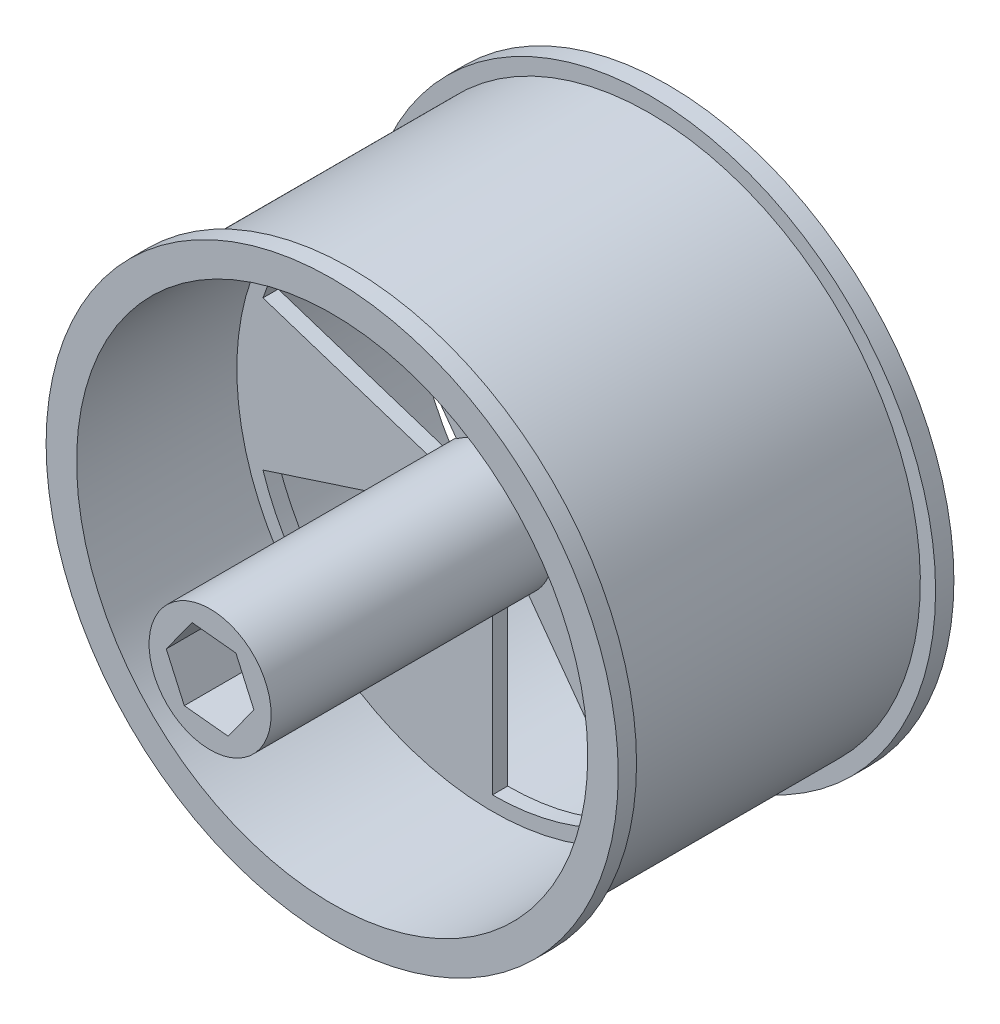
ISO-10303-21;
HEADER;
FILE_DESCRIPTION(('STEP AP214'),'2;1');
FILE_NAME('part.step','',(''),(''),'','','');
FILE_SCHEMA(('AUTOMOTIVE_DESIGN { 1 0 10303 214 1 1 1 1 }'));
ENDSEC;
DATA;
#1=APPLICATION_CONTEXT('core data for automotive mechanical design processes');
#2=APPLICATION_PROTOCOL_DEFINITION('international standard','automotive_design',2000,#1);
#3=PRODUCT_CONTEXT('',#1,'mechanical');
#4=PRODUCT('Part','Part','',(#3));
#5=PRODUCT_RELATED_PRODUCT_CATEGORY('part','',(#4));
#6=PRODUCT_DEFINITION_FORMATION('','',#4);
#7=PRODUCT_DEFINITION_CONTEXT('part definition',#1,'design');
#8=PRODUCT_DEFINITION('design','',#6,#7);
#9=PRODUCT_DEFINITION_SHAPE('','',#8);
#10=(LENGTH_UNIT() NAMED_UNIT(*) SI_UNIT(.MILLI.,.METRE.));
#11=(NAMED_UNIT(*) PLANE_ANGLE_UNIT() SI_UNIT($,.RADIAN.));
#12=(NAMED_UNIT(*) SI_UNIT($,.STERADIAN.) SOLID_ANGLE_UNIT());
#13=UNCERTAINTY_MEASURE_WITH_UNIT(LENGTH_MEASURE(1.E-05),#10,'distance_accuracy_value','');
#14=(GEOMETRIC_REPRESENTATION_CONTEXT(3) GLOBAL_UNCERTAINTY_ASSIGNED_CONTEXT((#13)) GLOBAL_UNIT_ASSIGNED_CONTEXT((#10,
#11,#12)) REPRESENTATION_CONTEXT('',''));
#15=CARTESIAN_POINT('',(0.,0.,0.));
#16=DIRECTION('',(0.,0.,1.));
#17=DIRECTION('',(1.,0.,0.));
#18=AXIS2_PLACEMENT_3D('',#15,#16,#17);
#19=CARTESIAN_POINT('',(0.,0.,14.605));
#20=DIRECTION('',(0.,0.,1.));
#21=DIRECTION('',(1.,0.,0.));
#22=AXIS2_PLACEMENT_3D('',#19,#20,#21);
#23=PLANE('',#22);
#24=CARTESIAN_POINT('',(0.,0.,14.605));
#25=DIRECTION('',(0.,0.,1.));
#26=DIRECTION('',(1.,0.,0.));
#27=AXIS2_PLACEMENT_3D('',#24,#25,#26);
#28=CIRCLE('',#27,21.2725);
#29=CARTESIAN_POINT('',(21.2725,0.,14.605));
#30=VERTEX_POINT('',#29);
#31=EDGE_CURVE('E483',#30,#30,#28,.T.);
#32=ORIENTED_EDGE('',*,*,#31,.T.);
#33=EDGE_LOOP('',(#32));
#34=FACE_BOUND('',#33,.T.);
#35=DIRECTION('',(0.951056516295152,-0.309016994374953,0.));
#36=VECTOR('',#35,1.);
#37=CARTESIAN_POINT('',(0.,0.,14.605));
#38=LINE('',#37,#36);
#39=CARTESIAN_POINT('',(4.83136710277938,-1.56980633142474,14.605));
#40=VERTEX_POINT('',#39);
#41=CARTESIAN_POINT('',(19.0936857187198,-6.20391456369309,14.605));
#42=VERTEX_POINT('',#41);
#43=EDGE_CURVE('E516',#40,#42,#38,.T.);
#44=ORIENTED_EDGE('',*,*,#43,.F.);
#45=CARTESIAN_POINT('',(0.,0.,14.605));
#46=DIRECTION('',(0.,0.,1.));
#47=DIRECTION('',(1.,0.,0.));
#48=AXIS2_PLACEMENT_3D('',#45,#46,#47);
#49=CIRCLE('',#48,5.08);
#50=CARTESIAN_POINT('',(2.98594908164576,-4.10980633142473,14.605));
#51=VERTEX_POINT('',#50);
#52=EDGE_CURVE('E277',#51,#40,#49,.T.);
#53=ORIENTED_EDGE('',*,*,#52,.F.);
#54=DIRECTION('',(-0.587785252292467,0.809016994374952,0.));
#55=VECTOR('',#54,1.);
#56=CARTESIAN_POINT('',(0.,0.,14.605));
#57=LINE('',#56,#55);
#58=CARTESIAN_POINT('',(11.8005467446771,-16.2420591910488,14.605));
#59=VERTEX_POINT('',#58);
#60=EDGE_CURVE('E501',#59,#51,#57,.T.);
#61=ORIENTED_EDGE('',*,*,#60,.F.);
#62=CARTESIAN_POINT('',(0.,0.,14.605));
#63=DIRECTION('',(0.,0.,1.));
#64=DIRECTION('',(1.,0.,0.));
#65=AXIS2_PLACEMENT_3D('',#62,#63,#64);
#66=CIRCLE('',#65,20.0762892547115);
#67=CARTESIAN_POINT('',(-1.42681005899092E-13,-20.0762892547115,14.605));
#68=VERTEX_POINT('',#67);
#69=EDGE_CURVE('E508',#68,#59,#66,.T.);
#70=ORIENTED_EDGE('',*,*,#69,.F.);
#71=DIRECTION('',(0.,-1.,0.));
#72=VECTOR('',#71,1.);
#73=CARTESIAN_POINT('',(0.,0.,14.605));
#74=LINE('',#73,#72);
#75=CARTESIAN_POINT('',(0.,-5.08,14.605));
#76=VERTEX_POINT('',#75);
#77=EDGE_CURVE('E505',#76,#68,#74,.T.);
#78=ORIENTED_EDGE('',*,*,#77,.F.);
#79=CARTESIAN_POINT('',(-2.98594908164576,-4.10980633142473,14.605));
#80=VERTEX_POINT('',#79);
#81=EDGE_CURVE('E922',#80,#76,#49,.T.);
#82=ORIENTED_EDGE('',*,*,#81,.F.);
#83=DIRECTION('',(0.587785252292483,0.80901699437494,0.));
#84=VECTOR('',#83,1.);
#85=CARTESIAN_POINT('',(0.,0.,14.605));
#86=LINE('',#85,#84);
#87=CARTESIAN_POINT('',(-11.8005467446775,-16.2420591910487,14.605));
#88=VERTEX_POINT('',#87);
#89=EDGE_CURVE('E523',#88,#80,#86,.T.);
#90=ORIENTED_EDGE('',*,*,#89,.F.);
#91=CARTESIAN_POINT('',(0.,0.,14.605));
#92=DIRECTION('',(0.,0.,1.));
#93=DIRECTION('',(1.,0.,0.));
#94=AXIS2_PLACEMENT_3D('',#91,#92,#93);
#95=CIRCLE('',#94,20.0762892547115);
#96=CARTESIAN_POINT('',(-19.0936857187198,-6.20391456369282,14.605));
#97=VERTEX_POINT('',#96);
#98=EDGE_CURVE('E530',#97,#88,#95,.T.);
#99=ORIENTED_EDGE('',*,*,#98,.F.);
#100=DIRECTION('',(-0.951056516295158,-0.309016994374935,0.));
#101=VECTOR('',#100,1.);
#102=CARTESIAN_POINT('',(0.,0.,14.605));
#103=LINE('',#102,#101);
#104=CARTESIAN_POINT('',(-4.83136710277938,-1.56980633142473,14.605));
#105=VERTEX_POINT('',#104);
#106=EDGE_CURVE('E527',#105,#97,#103,.T.);
#107=ORIENTED_EDGE('',*,*,#106,.F.);
#108=CARTESIAN_POINT('',(-4.83136710277938,1.56980633142473,14.605));
#109=VERTEX_POINT('',#108);
#110=EDGE_CURVE('E550',#109,#105,#49,.T.);
#111=ORIENTED_EDGE('',*,*,#110,.F.);
#112=DIRECTION('',(0.951056516295149,-0.309016994374962,0.));
#113=VECTOR('',#112,1.);
#114=CARTESIAN_POINT('',(0.,0.,14.605));
#115=LINE('',#114,#113);
#116=CARTESIAN_POINT('',(-19.0936857187197,6.20391456369331,14.605));
#117=VERTEX_POINT('',#116);
#118=EDGE_CURVE('E534',#117,#109,#115,.T.);
#119=ORIENTED_EDGE('',*,*,#118,.F.);
#120=CARTESIAN_POINT('',(0.,0.,14.605));
#121=DIRECTION('',(0.,0.,1.));
#122=DIRECTION('',(1.,0.,0.));
#123=AXIS2_PLACEMENT_3D('',#120,#121,#122);
#124=CIRCLE('',#123,20.0762892547115);
#125=CARTESIAN_POINT('',(-11.8005467446771,16.2420591910489,14.605));
#126=VERTEX_POINT('',#125);
#127=EDGE_CURVE('E12',#126,#117,#124,.T.);
#128=ORIENTED_EDGE('',*,*,#127,.F.);
#129=DIRECTION('',(-0.58778525229246,0.809016994374957,0.));
#130=VECTOR('',#129,1.);
#131=CARTESIAN_POINT('',(0.,0.,14.605));
#132=LINE('',#131,#130);
#133=CARTESIAN_POINT('',(-2.98594908164576,4.10980633142474,14.605));
#134=VERTEX_POINT('',#133);
#135=EDGE_CURVE('E50',#134,#126,#132,.T.);
#136=ORIENTED_EDGE('',*,*,#135,.F.);
#137=CARTESIAN_POINT('',(0.,5.08,14.605));
#138=VERTEX_POINT('',#137);
#139=EDGE_CURVE('E293',#138,#134,#49,.T.);
#140=ORIENTED_EDGE('',*,*,#139,.F.);
#141=DIRECTION('',(0.,-1.,0.));
#142=VECTOR('',#141,1.);
#143=CARTESIAN_POINT('',(0.,0.,14.605));
#144=LINE('',#143,#142);
#145=CARTESIAN_POINT('',(0.,20.0762892547115,14.605));
#146=VERTEX_POINT('',#145);
#147=EDGE_CURVE('E490',#146,#138,#144,.T.);
#148=ORIENTED_EDGE('',*,*,#147,.F.);
#149=CARTESIAN_POINT('',(0.,0.,14.605));
#150=DIRECTION('',(0.,0.,1.));
#151=DIRECTION('',(1.,0.,0.));
#152=AXIS2_PLACEMENT_3D('',#149,#150,#151);
#153=CIRCLE('',#152,20.0762892547115);
#154=CARTESIAN_POINT('',(11.8005467446773,16.2420591910488,14.605));
#155=VERTEX_POINT('',#154);
#156=EDGE_CURVE('E497',#155,#146,#153,.T.);
#157=ORIENTED_EDGE('',*,*,#156,.F.);
#158=DIRECTION('',(0.587785252292474,0.809016994374947,0.));
#159=VECTOR('',#158,1.);
#160=CARTESIAN_POINT('',(0.,0.,14.605));
#161=LINE('',#160,#159);
#162=CARTESIAN_POINT('',(2.98594908164577,4.10980633142473,14.605));
#163=VERTEX_POINT('',#162);
#164=EDGE_CURVE('E494',#163,#155,#161,.T.);
#165=ORIENTED_EDGE('',*,*,#164,.F.);
#166=CARTESIAN_POINT('',(4.83136710277938,1.56980633142473,14.605));
#167=VERTEX_POINT('',#166);
#168=EDGE_CURVE('E289',#167,#163,#49,.T.);
#169=ORIENTED_EDGE('',*,*,#168,.F.);
#170=DIRECTION('',(-0.951056516295155,-0.309016994374944,0.));
#171=VECTOR('',#170,1.);
#172=CARTESIAN_POINT('',(0.,0.,14.605));
#173=LINE('',#172,#171);
#174=CARTESIAN_POINT('',(19.0936857187198,6.20391456369294,14.605));
#175=VERTEX_POINT('',#174);
#176=EDGE_CURVE('E512',#175,#167,#173,.T.);
#177=ORIENTED_EDGE('',*,*,#176,.F.);
#178=CARTESIAN_POINT('',(0.,0.,14.605));
#179=DIRECTION('',(0.,0.,1.));
#180=DIRECTION('',(1.,0.,0.));
#181=AXIS2_PLACEMENT_3D('',#178,#179,#180);
#182=CIRCLE('',#181,20.0762892547115);
#183=EDGE_CURVE('E519',#42,#175,#182,.T.);
#184=ORIENTED_EDGE('',*,*,#183,.F.);
#185=EDGE_LOOP('',(#44,#53,#61,#70,#78,#82,#90,#99,#107,#111,#119,#128,#136,#140,#148,#157,#165,
#169,#177,#184));
#186=FACE_BOUND('',#185,.T.);
#187=ADVANCED_FACE('F41',(#34,#186),#23,.T.);
#188=CARTESIAN_POINT('',(0.,0.,27.94));
#189=DIRECTION('',(0.,0.,-1.));
#190=DIRECTION('',(-1.,0.,0.));
#191=AXIS2_PLACEMENT_3D('',#188,#189,#190);
#192=CYLINDRICAL_SURFACE('',#191,21.2725);
#193=CARTESIAN_POINT('',(0.,0.,0.));
#194=DIRECTION('',(0.,0.,1.));
#195=DIRECTION('',(1.,0.,0.));
#196=AXIS2_PLACEMENT_3D('',#193,#194,#195);
#197=CIRCLE('',#196,21.2725);
#198=CARTESIAN_POINT('',(21.2725,0.,0.));
#199=VERTEX_POINT('',#198);
#200=EDGE_CURVE('E470',#199,#199,#197,.T.);
#201=ORIENTED_EDGE('',*,*,#200,.F.);
#202=EDGE_LOOP('',(#201));
#203=FACE_BOUND('',#202,.T.);
#204=CARTESIAN_POINT('',(0.,0.,13.335));
#205=DIRECTION('',(0.,0.,1.));
#206=DIRECTION('',(1.,0.,0.));
#207=AXIS2_PLACEMENT_3D('',#204,#205,#206);
#208=CIRCLE('',#207,21.2725);
#209=CARTESIAN_POINT('',(21.2725,0.,13.335));
#210=VERTEX_POINT('',#209);
#211=EDGE_CURVE('E450',#210,#210,#208,.T.);
#212=ORIENTED_EDGE('',*,*,#211,.T.);
#213=EDGE_LOOP('',(#212));
#214=FACE_BOUND('',#213,.T.);
#215=ADVANCED_FACE('F569',(#203,#214),#192,.F.);
#216=CARTESIAN_POINT('',(0.,0.,27.94));
#217=DIRECTION('',(0.,0.,-1.));
#218=DIRECTION('',(-1.,0.,0.));
#219=AXIS2_PLACEMENT_3D('',#216,#217,#218);
#220=CYLINDRICAL_SURFACE('',#219,23.8125);
#221=CARTESIAN_POINT('',(0.,0.,1.524));
#222=DIRECTION('',(0.,0.,-1.));
#223=DIRECTION('',(0.,1.,0.));
#224=AXIS2_PLACEMENT_3D('',#221,#222,#223);
#225=CIRCLE('',#224,23.8125);
#226=CARTESIAN_POINT('',(0.,23.8125,1.524));
#227=VERTEX_POINT('',#226);
#228=EDGE_CURVE('E454',#227,#227,#225,.T.);
#229=ORIENTED_EDGE('',*,*,#228,.T.);
#230=EDGE_LOOP('',(#229));
#231=FACE_BOUND('',#230,.T.);
#232=CARTESIAN_POINT('',(0.,0.,0.));
#233=DIRECTION('',(0.,0.,1.));
#234=DIRECTION('',(1.,0.,0.));
#235=AXIS2_PLACEMENT_3D('',#232,#233,#234);
#236=CIRCLE('',#235,23.8125);
#237=CARTESIAN_POINT('',(23.8125,0.,0.));
#238=VERTEX_POINT('',#237);
#239=EDGE_CURVE('E475',#238,#238,#236,.T.);
#240=ORIENTED_EDGE('',*,*,#239,.T.);
#241=EDGE_LOOP('',(#240));
#242=FACE_BOUND('',#241,.T.);
#243=ADVANCED_FACE('F571',(#231,#242),#220,.T.);
#244=CARTESIAN_POINT('',(0.,0.,27.94));
#245=DIRECTION('',(0.,0.,1.));
#246=DIRECTION('',(1.,0.,0.));
#247=AXIS2_PLACEMENT_3D('',#244,#245,#246);
#248=PLANE('',#247);
#249=CARTESIAN_POINT('',(0.,0.,27.94));
#250=DIRECTION('',(0.,0.,1.));
#251=DIRECTION('',(1.,0.,0.));
#252=AXIS2_PLACEMENT_3D('',#249,#250,#251);
#253=CIRCLE('',#252,23.8125);
#254=CARTESIAN_POINT('',(23.8125,0.,27.94));
#255=VERTEX_POINT('',#254);
#256=EDGE_CURVE('E479',#255,#255,#253,.T.);
#257=ORIENTED_EDGE('',*,*,#256,.T.);
#258=EDGE_LOOP('',(#257));
#259=FACE_BOUND('',#258,.T.);
#260=CARTESIAN_POINT('',(0.,0.,27.94));
#261=DIRECTION('',(0.,0.,1.));
#262=DIRECTION('',(1.,0.,0.));
#263=AXIS2_PLACEMENT_3D('',#260,#261,#262);
#264=CIRCLE('',#263,21.2725);
#265=CARTESIAN_POINT('',(21.2725,0.,27.94));
#266=VERTEX_POINT('',#265);
#267=EDGE_CURVE('E471',#266,#266,#264,.T.);
#268=ORIENTED_EDGE('',*,*,#267,.F.);
#269=EDGE_LOOP('',(#268));
#270=FACE_BOUND('',#269,.T.);
#271=ADVANCED_FACE('F579',(#259,#270),#248,.T.);
#272=CARTESIAN_POINT('',(0.,0.,0.));
#273=DIRECTION('',(0.,0.,1.));
#274=DIRECTION('',(1.,0.,0.));
#275=AXIS2_PLACEMENT_3D('',#272,#273,#274);
#276=PLANE('',#275);
#277=ORIENTED_EDGE('',*,*,#239,.F.);
#278=EDGE_LOOP('',(#277));
#279=FACE_BOUND('',#278,.T.);
#280=ORIENTED_EDGE('',*,*,#200,.T.);
#281=EDGE_LOOP('',(#280));
#282=FACE_BOUND('',#281,.T.);
#283=ADVANCED_FACE('F595',(#279,#282),#276,.F.);
#284=CARTESIAN_POINT('',(0.,0.,26.416));
#285=DIRECTION('',(0.,0.,-1.));
#286=DIRECTION('',(0.,1.,0.));
#287=AXIS2_PLACEMENT_3D('',#284,#285,#286);
#288=CIRCLE('',#287,23.8125);
#289=CARTESIAN_POINT('',(0.,23.8125,26.416));
#290=VERTEX_POINT('',#289);
#291=EDGE_CURVE('E458',#290,#290,#288,.T.);
#292=ORIENTED_EDGE('',*,*,#291,.F.);
#293=EDGE_LOOP('',(#292));
#294=FACE_BOUND('',#293,.T.);
#295=ORIENTED_EDGE('',*,*,#256,.F.);
#296=EDGE_LOOP('',(#295));
#297=FACE_BOUND('',#296,.T.);
#298=ADVANCED_FACE('F43',(#294,#297),#220,.T.);
#299=ORIENTED_EDGE('',*,*,#31,.F.);
#300=EDGE_LOOP('',(#299));
#301=FACE_BOUND('',#300,.T.);
#302=ORIENTED_EDGE('',*,*,#267,.T.);
#303=EDGE_LOOP('',(#302));
#304=FACE_BOUND('',#303,.T.);
#305=ADVANCED_FACE('F574',(#301,#304),#192,.F.);
#306=CARTESIAN_POINT('',(0.,23.8125,1.524));
#307=DIRECTION('',(0.,0.,-1.));
#308=DIRECTION('',(0.,1.,0.));
#309=AXIS2_PLACEMENT_3D('',#306,#307,#308);
#310=PLANE('',#309);
#311=ORIENTED_EDGE('',*,*,#228,.F.);
#312=EDGE_LOOP('',(#311));
#313=FACE_BOUND('',#312,.T.);
#314=CARTESIAN_POINT('',(0.,0.,1.524));
#315=DIRECTION('',(0.,0.,-1.));
#316=DIRECTION('',(0.,1.,0.));
#317=AXIS2_PLACEMENT_3D('',#314,#315,#316);
#318=CIRCLE('',#317,22.5425);
#319=CARTESIAN_POINT('',(0.,22.5425,1.524));
#320=VERTEX_POINT('',#319);
#321=EDGE_CURVE('E466',#320,#320,#318,.T.);
#322=ORIENTED_EDGE('',*,*,#321,.T.);
#323=EDGE_LOOP('',(#322));
#324=FACE_BOUND('',#323,.T.);
#325=ADVANCED_FACE('F587',(#313,#324),#310,.F.);
#326=CARTESIAN_POINT('',(0.,0.,0.));
#327=DIRECTION('',(0.,0.,-1.));
#328=DIRECTION('',(0.,1.,0.));
#329=AXIS2_PLACEMENT_3D('',#326,#327,#328);
#330=CYLINDRICAL_SURFACE('',#329,22.5425);
#331=ORIENTED_EDGE('',*,*,#321,.F.);
#332=EDGE_LOOP('',(#331));
#333=FACE_BOUND('',#332,.T.);
#334=CARTESIAN_POINT('',(0.,0.,26.416));
#335=DIRECTION('',(0.,0.,-1.));
#336=DIRECTION('',(0.,1.,0.));
#337=AXIS2_PLACEMENT_3D('',#334,#335,#336);
#338=CIRCLE('',#337,22.5425);
#339=CARTESIAN_POINT('',(0.,22.5425,26.416));
#340=VERTEX_POINT('',#339);
#341=EDGE_CURVE('E462',#340,#340,#338,.T.);
#342=ORIENTED_EDGE('',*,*,#341,.T.);
#343=EDGE_LOOP('',(#342));
#344=FACE_BOUND('',#343,.T.);
#345=ADVANCED_FACE('F593',(#333,#344),#330,.T.);
#346=CARTESIAN_POINT('',(0.,23.8125,26.416));
#347=DIRECTION('',(0.,0.,1.));
#348=DIRECTION('',(0.,-1.,0.));
#349=AXIS2_PLACEMENT_3D('',#346,#347,#348);
#350=PLANE('',#349);
#351=ORIENTED_EDGE('',*,*,#341,.F.);
#352=EDGE_LOOP('',(#351));
#353=FACE_BOUND('',#352,.T.);
#354=ORIENTED_EDGE('',*,*,#291,.T.);
#355=EDGE_LOOP('',(#354));
#356=FACE_BOUND('',#355,.T.);
#357=ADVANCED_FACE('F561',(#353,#356),#350,.F.);
#358=CARTESIAN_POINT('',(0.,0.,13.335));
#359=DIRECTION('',(0.,0.,1.));
#360=DIRECTION('',(1.,0.,0.));
#361=AXIS2_PLACEMENT_3D('',#358,#359,#360);
#362=PLANE('',#361);
#363=DIRECTION('',(-0.58778525229246,0.809016994374957,0.));
#364=VECTOR('',#363,1.);
#365=CARTESIAN_POINT('',(0.,0.,13.335));
#366=LINE('',#365,#364);
#367=CARTESIAN_POINT('',(-2.98594908164576,4.10980633142474,13.335));
#368=VERTEX_POINT('',#367);
#369=CARTESIAN_POINT('',(-11.8005467446771,16.2420591910489,13.335));
#370=VERTEX_POINT('',#369);
#371=EDGE_CURVE('E442',#368,#370,#366,.T.);
#372=ORIENTED_EDGE('',*,*,#371,.T.);
#373=CARTESIAN_POINT('',(0.,0.,13.335));
#374=DIRECTION('',(0.,0.,1.));
#375=DIRECTION('',(1.,0.,0.));
#376=AXIS2_PLACEMENT_3D('',#373,#374,#375);
#377=CIRCLE('',#376,20.0762892547115);
#378=CARTESIAN_POINT('',(-19.0936857187197,6.20391456369323,13.335));
#379=VERTEX_POINT('',#378);
#380=EDGE_CURVE('E446',#370,#379,#377,.T.);
#381=ORIENTED_EDGE('',*,*,#380,.T.);
#382=DIRECTION('',(0.951056516295149,-0.309016994374962,0.));
#383=VECTOR('',#382,1.);
#384=CARTESIAN_POINT('',(0.,0.,13.335));
#385=LINE('',#384,#383);
#386=CARTESIAN_POINT('',(-4.83136710277938,1.56980633142482,13.335));
#387=VERTEX_POINT('',#386);
#388=EDGE_CURVE('E434',#379,#387,#385,.T.);
#389=ORIENTED_EDGE('',*,*,#388,.T.);
#390=CARTESIAN_POINT('',(0.,0.,13.335));
#391=DIRECTION('',(0.,0.,1.));
#392=DIRECTION('',(1.,0.,0.));
#393=AXIS2_PLACEMENT_3D('',#390,#391,#392);
#394=CIRCLE('',#393,5.08);
#395=EDGE_CURVE('E438',#387,#368,#394,.F.);
#396=ORIENTED_EDGE('',*,*,#395,.T.);
#397=EDGE_LOOP('',(#372,#381,#389,#396));
#398=FACE_BOUND('',#397,.T.);
#399=DIRECTION('',(-0.951056516295158,-0.309016994374935,0.));
#400=VECTOR('',#399,1.);
#401=CARTESIAN_POINT('',(0.,0.,13.335));
#402=LINE('',#401,#400);
#403=CARTESIAN_POINT('',(-4.83136710277938,-1.56980633142473,13.335));
#404=VERTEX_POINT('',#403);
#405=CARTESIAN_POINT('',(-19.0936857187198,-6.20391456369282,13.335));
#406=VERTEX_POINT('',#405);
#407=EDGE_CURVE('E426',#404,#406,#402,.T.);
#408=ORIENTED_EDGE('',*,*,#407,.T.);
#409=CARTESIAN_POINT('',(0.,0.,13.335));
#410=DIRECTION('',(0.,0.,1.));
#411=DIRECTION('',(1.,0.,0.));
#412=AXIS2_PLACEMENT_3D('',#409,#410,#411);
#413=CIRCLE('',#412,20.0762892547115);
#414=CARTESIAN_POINT('',(-11.8005467446774,-16.2420591910487,13.335));
#415=VERTEX_POINT('',#414);
#416=EDGE_CURVE('E430',#406,#415,#413,.T.);
#417=ORIENTED_EDGE('',*,*,#416,.T.);
#418=DIRECTION('',(0.587785252292483,0.80901699437494,0.));
#419=VECTOR('',#418,1.);
#420=CARTESIAN_POINT('',(0.,0.,13.335));
#421=LINE('',#420,#419);
#422=CARTESIAN_POINT('',(-2.98594908164584,-4.10980633142473,13.335));
#423=VERTEX_POINT('',#422);
#424=EDGE_CURVE('E418',#415,#423,#421,.T.);
#425=ORIENTED_EDGE('',*,*,#424,.T.);
#426=CARTESIAN_POINT('',(0.,0.,13.335));
#427=DIRECTION('',(0.,0.,1.));
#428=DIRECTION('',(1.,0.,0.));
#429=AXIS2_PLACEMENT_3D('',#426,#427,#428);
#430=CIRCLE('',#429,5.08);
#431=EDGE_CURVE('E422',#423,#404,#430,.F.);
#432=ORIENTED_EDGE('',*,*,#431,.T.);
#433=EDGE_LOOP('',(#408,#417,#425,#432));
#434=FACE_BOUND('',#433,.T.);
#435=DIRECTION('',(0.951056516295152,-0.309016994374953,0.));
#436=VECTOR('',#435,1.);
#437=CARTESIAN_POINT('',(0.,0.,13.335));
#438=LINE('',#437,#436);
#439=CARTESIAN_POINT('',(4.83136710277938,-1.56980633142474,13.335));
#440=VERTEX_POINT('',#439);
#441=CARTESIAN_POINT('',(19.0936857187198,-6.20391456369309,13.335));
#442=VERTEX_POINT('',#441);
#443=EDGE_CURVE('E410',#440,#442,#438,.T.);
#444=ORIENTED_EDGE('',*,*,#443,.T.);
#445=CARTESIAN_POINT('',(0.,0.,13.335));
#446=DIRECTION('',(0.,0.,1.));
#447=DIRECTION('',(1.,0.,0.));
#448=AXIS2_PLACEMENT_3D('',#445,#446,#447);
#449=CIRCLE('',#448,20.0762892547115);
#450=CARTESIAN_POINT('',(19.0936857187198,6.20391456369296,13.335));
#451=VERTEX_POINT('',#450);
#452=EDGE_CURVE('E414',#442,#451,#449,.T.);
#453=ORIENTED_EDGE('',*,*,#452,.T.);
#454=DIRECTION('',(-0.951056516295155,-0.309016994374944,0.));
#455=VECTOR('',#454,1.);
#456=CARTESIAN_POINT('',(0.,0.,13.335));
#457=LINE('',#456,#455);
#458=CARTESIAN_POINT('',(4.83136710277938,1.56980633142471,13.335));
#459=VERTEX_POINT('',#458);
#460=EDGE_CURVE('E402',#451,#459,#457,.T.);
#461=ORIENTED_EDGE('',*,*,#460,.T.);
#462=CARTESIAN_POINT('',(0.,0.,13.335));
#463=DIRECTION('',(0.,0.,1.));
#464=DIRECTION('',(1.,0.,0.));
#465=AXIS2_PLACEMENT_3D('',#462,#463,#464);
#466=CIRCLE('',#465,5.08);
#467=EDGE_CURVE('E406',#459,#440,#466,.F.);
#468=ORIENTED_EDGE('',*,*,#467,.T.);
#469=EDGE_LOOP('',(#444,#453,#461,#468));
#470=FACE_BOUND('',#469,.T.);
#471=DIRECTION('',(0.,-1.,0.));
#472=VECTOR('',#471,1.);
#473=CARTESIAN_POINT('',(0.,0.,13.335));
#474=LINE('',#473,#472);
#475=CARTESIAN_POINT('',(0.,-5.08,13.335));
#476=VERTEX_POINT('',#475);
#477=CARTESIAN_POINT('',(-1.42681005899092E-13,-20.0762892547115,13.335));
#478=VERTEX_POINT('',#477);
#479=EDGE_CURVE('E394',#476,#478,#474,.T.);
#480=ORIENTED_EDGE('',*,*,#479,.T.);
#481=CARTESIAN_POINT('',(0.,0.,13.335));
#482=DIRECTION('',(0.,0.,1.));
#483=DIRECTION('',(1.,0.,0.));
#484=AXIS2_PLACEMENT_3D('',#481,#482,#483);
#485=CIRCLE('',#484,20.0762892547115);
#486=CARTESIAN_POINT('',(11.8005467446772,-16.2420591910488,13.335));
#487=VERTEX_POINT('',#486);
#488=EDGE_CURVE('E398',#478,#487,#485,.T.);
#489=ORIENTED_EDGE('',*,*,#488,.T.);
#490=DIRECTION('',(-0.587785252292467,0.809016994374952,0.));
#491=VECTOR('',#490,1.);
#492=CARTESIAN_POINT('',(0.,0.,13.335));
#493=LINE('',#492,#491);
#494=CARTESIAN_POINT('',(2.98594908164572,-4.10980633142473,13.335));
#495=VERTEX_POINT('',#494);
#496=EDGE_CURVE('E386',#487,#495,#493,.T.);
#497=ORIENTED_EDGE('',*,*,#496,.T.);
#498=CARTESIAN_POINT('',(0.,0.,13.335));
#499=DIRECTION('',(0.,0.,1.));
#500=DIRECTION('',(1.,0.,0.));
#501=AXIS2_PLACEMENT_3D('',#498,#499,#500);
#502=CIRCLE('',#501,5.08);
#503=EDGE_CURVE('E390',#495,#476,#502,.F.);
#504=ORIENTED_EDGE('',*,*,#503,.T.);
#505=EDGE_LOOP('',(#480,#489,#497,#504));
#506=FACE_BOUND('',#505,.T.);
#507=DIRECTION('',(0.587785252292474,0.809016994374947,0.));
#508=VECTOR('',#507,1.);
#509=CARTESIAN_POINT('',(0.,0.,13.335));
#510=LINE('',#509,#508);
#511=CARTESIAN_POINT('',(2.98594908164577,4.10980633142473,13.335));
#512=VERTEX_POINT('',#511);
#513=CARTESIAN_POINT('',(11.8005467446773,16.2420591910488,13.335));
#514=VERTEX_POINT('',#513);
#515=EDGE_CURVE('E378',#512,#514,#510,.T.);
#516=ORIENTED_EDGE('',*,*,#515,.T.);
#517=CARTESIAN_POINT('',(0.,0.,13.335));
#518=DIRECTION('',(0.,0.,1.));
#519=DIRECTION('',(1.,0.,0.));
#520=AXIS2_PLACEMENT_3D('',#517,#518,#519);
#521=CIRCLE('',#520,20.0762892547115);
#522=CARTESIAN_POINT('',(0.,20.0762892547115,13.335));
#523=VERTEX_POINT('',#522);
#524=EDGE_CURVE('E382',#514,#523,#521,.T.);
#525=ORIENTED_EDGE('',*,*,#524,.T.);
#526=DIRECTION('',(0.,-1.,0.));
#527=VECTOR('',#526,1.);
#528=CARTESIAN_POINT('',(0.,0.,13.335));
#529=LINE('',#528,#527);
#530=CARTESIAN_POINT('',(0.,5.08,13.335));
#531=VERTEX_POINT('',#530);
#532=EDGE_CURVE('E360',#523,#531,#529,.T.);
#533=ORIENTED_EDGE('',*,*,#532,.T.);
#534=CARTESIAN_POINT('',(0.,0.,13.335));
#535=DIRECTION('',(0.,0.,1.));
#536=DIRECTION('',(1.,0.,0.));
#537=AXIS2_PLACEMENT_3D('',#534,#535,#536);
#538=CIRCLE('',#537,5.08);
#539=EDGE_CURVE('E374',#531,#512,#538,.F.);
#540=ORIENTED_EDGE('',*,*,#539,.T.);
#541=EDGE_LOOP('',(#516,#525,#533,#540));
#542=FACE_BOUND('',#541,.T.);
#543=ORIENTED_EDGE('',*,*,#211,.F.);
#544=EDGE_LOOP('',(#543));
#545=FACE_BOUND('',#544,.T.);
#546=ADVANCED_FACE('F557',(#398,#434,#470,#506,#542,#545),#362,.F.);
#547=CARTESIAN_POINT('',(0.,0.,0.));
#548=DIRECTION('',(0.,0.,1.));
#549=DIRECTION('',(1.,0.,0.));
#550=AXIS2_PLACEMENT_3D('',#547,#548,#549);
#551=CYLINDRICAL_SURFACE('',#550,20.0762892547115);
#552=DIRECTION('',(0.,0.,1.));
#553=VECTOR('',#552,1.);
#554=CARTESIAN_POINT('',(11.8005467446773,16.2420591910488,0.));
#555=LINE('',#554,#553);
#556=EDGE_CURVE('E356',#514,#155,#555,.T.);
#557=ORIENTED_EDGE('',*,*,#556,.T.);
#558=ORIENTED_EDGE('',*,*,#156,.T.);
#559=DIRECTION('',(0.,0.,1.));
#560=VECTOR('',#559,1.);
#561=CARTESIAN_POINT('',(0.,20.0762892547115,0.));
#562=LINE('',#561,#560);
#563=EDGE_CURVE('E319',#523,#146,#562,.T.);
#564=ORIENTED_EDGE('',*,*,#563,.F.);
#565=ORIENTED_EDGE('',*,*,#524,.F.);
#566=EDGE_LOOP('',(#557,#558,#564,#565));
#567=FACE_BOUND('',#566,.T.);
#568=ADVANCED_FACE('F560',(#567),#551,.F.);
#569=CARTESIAN_POINT('',(2.98594908164577,4.10980633142473,0.));
#570=DIRECTION('',(0.809016994374947,-0.587785252292474,0.));
#571=DIRECTION('',(0.587785252292474,0.809016994374947,0.));
#572=AXIS2_PLACEMENT_3D('',#569,#570,#571);
#573=PLANE('',#572);
#574=DIRECTION('',(0.,0.,1.));
#575=VECTOR('',#574,1.);
#576=CARTESIAN_POINT('',(2.98594908164577,4.10980633142473,0.));
#577=LINE('',#576,#575);
#578=EDGE_CURVE('E361',#512,#163,#577,.T.);
#579=ORIENTED_EDGE('',*,*,#578,.T.);
#580=ORIENTED_EDGE('',*,*,#164,.T.);
#581=ORIENTED_EDGE('',*,*,#556,.F.);
#582=ORIENTED_EDGE('',*,*,#515,.F.);
#583=EDGE_LOOP('',(#579,#580,#581,#582));
#584=FACE_BOUND('',#583,.T.);
#585=ADVANCED_FACE('F668',(#584),#573,.F.);
#586=CARTESIAN_POINT('',(0.,5.08,0.));
#587=DIRECTION('',(-1.,0.,0.));
#588=DIRECTION('',(0.,0.,1.));
#589=AXIS2_PLACEMENT_3D('',#586,#587,#588);
#590=PLANE('',#589);
#591=ORIENTED_EDGE('',*,*,#563,.T.);
#592=ORIENTED_EDGE('',*,*,#147,.T.);
#593=DIRECTION('',(0.,0.,1.));
#594=VECTOR('',#593,1.);
#595=CARTESIAN_POINT('',(0.,5.08,0.));
#596=LINE('',#595,#594);
#597=EDGE_CURVE('E365',#531,#138,#596,.T.);
#598=ORIENTED_EDGE('',*,*,#597,.F.);
#599=ORIENTED_EDGE('',*,*,#532,.F.);
#600=EDGE_LOOP('',(#591,#592,#598,#599));
#601=FACE_BOUND('',#600,.T.);
#602=ADVANCED_FACE('F682',(#601),#590,.F.);
#603=CARTESIAN_POINT('',(0.,0.,0.));
#604=DIRECTION('',(0.,0.,1.));
#605=DIRECTION('',(1.,0.,0.));
#606=AXIS2_PLACEMENT_3D('',#603,#604,#605);
#607=CYLINDRICAL_SURFACE('',#606,20.0762892547115);
#608=DIRECTION('',(0.,0.,1.));
#609=VECTOR('',#608,1.);
#610=CARTESIAN_POINT('',(-1.42681005899092E-13,-20.0762892547115,0.));
#611=LINE('',#610,#609);
#612=EDGE_CURVE('E298',#478,#68,#611,.T.);
#613=ORIENTED_EDGE('',*,*,#612,.T.);
#614=ORIENTED_EDGE('',*,*,#69,.T.);
#615=DIRECTION('',(0.,0.,1.));
#616=VECTOR('',#615,1.);
#617=CARTESIAN_POINT('',(11.8005467446772,-16.2420591910488,0.));
#618=LINE('',#617,#616);
#619=EDGE_CURVE('E311',#487,#59,#618,.T.);
#620=ORIENTED_EDGE('',*,*,#619,.F.);
#621=ORIENTED_EDGE('',*,*,#488,.F.);
#622=EDGE_LOOP('',(#613,#614,#620,#621));
#623=FACE_BOUND('',#622,.T.);
#624=ADVANCED_FACE('F676',(#623),#607,.F.);
#625=CARTESIAN_POINT('',(0.,-5.08,0.));
#626=DIRECTION('',(-1.,0.,0.));
#627=DIRECTION('',(0.,-1.,0.));
#628=AXIS2_PLACEMENT_3D('',#625,#626,#627);
#629=PLANE('',#628);
#630=DIRECTION('',(0.,0.,1.));
#631=VECTOR('',#630,1.);
#632=CARTESIAN_POINT('',(0.,-5.08,0.));
#633=LINE('',#632,#631);
#634=EDGE_CURVE('E303',#476,#76,#633,.T.);
#635=ORIENTED_EDGE('',*,*,#634,.T.);
#636=ORIENTED_EDGE('',*,*,#77,.T.);
#637=ORIENTED_EDGE('',*,*,#612,.F.);
#638=ORIENTED_EDGE('',*,*,#479,.F.);
#639=EDGE_LOOP('',(#635,#636,#637,#638));
#640=FACE_BOUND('',#639,.T.);
#641=ADVANCED_FACE('F681',(#640),#629,.F.);
#642=CARTESIAN_POINT('',(2.98594908164576,-4.10980633142473,0.));
#643=DIRECTION('',(0.809016994374952,0.587785252292467,0.));
#644=DIRECTION('',(-0.587785252292467,0.809016994374952,0.));
#645=AXIS2_PLACEMENT_3D('',#642,#643,#644);
#646=PLANE('',#645);
#647=ORIENTED_EDGE('',*,*,#619,.T.);
#648=ORIENTED_EDGE('',*,*,#60,.T.);
#649=DIRECTION('',(0.,0.,1.));
#650=VECTOR('',#649,1.);
#651=CARTESIAN_POINT('',(2.98594908164576,-4.10980633142473,0.));
#652=LINE('',#651,#650);
#653=EDGE_CURVE('E307',#495,#51,#652,.T.);
#654=ORIENTED_EDGE('',*,*,#653,.F.);
#655=ORIENTED_EDGE('',*,*,#496,.F.);
#656=EDGE_LOOP('',(#647,#648,#654,#655));
#657=FACE_BOUND('',#656,.T.);
#658=ADVANCED_FACE('F698',(#657),#646,.F.);
#659=CARTESIAN_POINT('',(0.,0.,0.));
#660=DIRECTION('',(0.,0.,1.));
#661=DIRECTION('',(1.,0.,0.));
#662=AXIS2_PLACEMENT_3D('',#659,#660,#661);
#663=CYLINDRICAL_SURFACE('',#662,20.0762892547115);
#664=DIRECTION('',(0.,0.,1.));
#665=VECTOR('',#664,1.);
#666=CARTESIAN_POINT('',(19.0936857187198,-6.20391456369309,0.));
#667=LINE('',#666,#665);
#668=EDGE_CURVE('E315',#442,#42,#667,.T.);
#669=ORIENTED_EDGE('',*,*,#668,.T.);
#670=ORIENTED_EDGE('',*,*,#183,.T.);
#671=DIRECTION('',(0.,0.,1.));
#672=VECTOR('',#671,1.);
#673=CARTESIAN_POINT('',(19.0936857187198,6.20391456369296,0.));
#674=LINE('',#673,#672);
#675=EDGE_CURVE('E302',#451,#175,#674,.T.);
#676=ORIENTED_EDGE('',*,*,#675,.F.);
#677=ORIENTED_EDGE('',*,*,#452,.F.);
#678=EDGE_LOOP('',(#669,#670,#676,#677));
#679=FACE_BOUND('',#678,.T.);
#680=ADVANCED_FACE('F692',(#679),#663,.F.);
#681=CARTESIAN_POINT('',(4.83136710277938,-1.56980633142474,0.));
#682=DIRECTION('',(-0.309016994374952,-0.951056516295152,0.));
#683=DIRECTION('',(0.951056516295152,-0.309016994374953,0.));
#684=AXIS2_PLACEMENT_3D('',#681,#682,#683);
#685=PLANE('',#684);
#686=DIRECTION('',(0.,0.,1.));
#687=VECTOR('',#686,1.);
#688=CARTESIAN_POINT('',(4.83136710277938,-1.56980633142474,0.));
#689=LINE('',#688,#687);
#690=EDGE_CURVE('E320',#440,#40,#689,.T.);
#691=ORIENTED_EDGE('',*,*,#690,.T.);
#692=ORIENTED_EDGE('',*,*,#43,.T.);
#693=ORIENTED_EDGE('',*,*,#668,.F.);
#694=ORIENTED_EDGE('',*,*,#443,.F.);
#695=EDGE_LOOP('',(#691,#692,#693,#694));
#696=FACE_BOUND('',#695,.T.);
#697=ADVANCED_FACE('F697',(#696),#685,.F.);
#698=CARTESIAN_POINT('',(4.83136710277938,1.56980633142473,0.));
#699=DIRECTION('',(-0.309016994374944,0.951056516295155,0.));
#700=DIRECTION('',(-0.951056516295155,-0.309016994374944,0.));
#701=AXIS2_PLACEMENT_3D('',#698,#699,#700);
#702=PLANE('',#701);
#703=ORIENTED_EDGE('',*,*,#675,.T.);
#704=ORIENTED_EDGE('',*,*,#176,.T.);
#705=DIRECTION('',(0.,0.,1.));
#706=VECTOR('',#705,1.);
#707=CARTESIAN_POINT('',(4.83136710277938,1.56980633142473,0.));
#708=LINE('',#707,#706);
#709=EDGE_CURVE('E324',#459,#167,#708,.T.);
#710=ORIENTED_EDGE('',*,*,#709,.F.);
#711=ORIENTED_EDGE('',*,*,#460,.F.);
#712=EDGE_LOOP('',(#703,#704,#710,#711));
#713=FACE_BOUND('',#712,.T.);
#714=ADVANCED_FACE('F714',(#713),#702,.F.);
#715=CARTESIAN_POINT('',(0.,0.,0.));
#716=DIRECTION('',(0.,0.,1.));
#717=DIRECTION('',(1.,0.,0.));
#718=AXIS2_PLACEMENT_3D('',#715,#716,#717);
#719=CYLINDRICAL_SURFACE('',#718,20.0762892547115);
#720=DIRECTION('',(0.,0.,1.));
#721=VECTOR('',#720,1.);
#722=CARTESIAN_POINT('',(-19.0936857187198,-6.20391456369282,0.));
#723=LINE('',#722,#721);
#724=EDGE_CURVE('E314',#406,#97,#723,.T.);
#725=ORIENTED_EDGE('',*,*,#724,.T.);
#726=ORIENTED_EDGE('',*,*,#98,.T.);
#727=DIRECTION('',(0.,0.,1.));
#728=VECTOR('',#727,1.);
#729=CARTESIAN_POINT('',(-11.8005467446774,-16.2420591910487,0.));
#730=LINE('',#729,#728);
#731=EDGE_CURVE('E341',#415,#88,#730,.T.);
#732=ORIENTED_EDGE('',*,*,#731,.F.);
#733=ORIENTED_EDGE('',*,*,#416,.F.);
#734=EDGE_LOOP('',(#725,#726,#732,#733));
#735=FACE_BOUND('',#734,.T.);
#736=ADVANCED_FACE('F708',(#735),#719,.F.);
#737=CARTESIAN_POINT('',(-4.83136710277938,-1.56980633142473,0.));
#738=DIRECTION('',(-0.309016994374935,0.951056516295158,0.));
#739=DIRECTION('',(-0.951056516295158,-0.309016994374935,0.));
#740=AXIS2_PLACEMENT_3D('',#737,#738,#739);
#741=PLANE('',#740);
#742=DIRECTION('',(0.,0.,1.));
#743=VECTOR('',#742,1.);
#744=CARTESIAN_POINT('',(-4.83136710277938,-1.56980633142473,0.));
#745=LINE('',#744,#743);
#746=EDGE_CURVE('E333',#404,#105,#745,.T.);
#747=ORIENTED_EDGE('',*,*,#746,.T.);
#748=ORIENTED_EDGE('',*,*,#106,.T.);
#749=ORIENTED_EDGE('',*,*,#724,.F.);
#750=ORIENTED_EDGE('',*,*,#407,.F.);
#751=EDGE_LOOP('',(#747,#748,#749,#750));
#752=FACE_BOUND('',#751,.T.);
#753=ADVANCED_FACE('F713',(#752),#741,.F.);
#754=CARTESIAN_POINT('',(-2.98594908164576,-4.10980633142473,0.));
#755=DIRECTION('',(0.80901699437494,-0.587785252292483,0.));
#756=DIRECTION('',(0.587785252292483,0.80901699437494,0.));
#757=AXIS2_PLACEMENT_3D('',#754,#755,#756);
#758=PLANE('',#757);
#759=ORIENTED_EDGE('',*,*,#731,.T.);
#760=ORIENTED_EDGE('',*,*,#89,.T.);
#761=DIRECTION('',(0.,0.,1.));
#762=VECTOR('',#761,1.);
#763=CARTESIAN_POINT('',(-2.98594908164576,-4.10980633142473,0.));
#764=LINE('',#763,#762);
#765=EDGE_CURVE('E337',#423,#80,#764,.T.);
#766=ORIENTED_EDGE('',*,*,#765,.F.);
#767=ORIENTED_EDGE('',*,*,#424,.F.);
#768=EDGE_LOOP('',(#759,#760,#766,#767));
#769=FACE_BOUND('',#768,.T.);
#770=ADVANCED_FACE('F728',(#769),#758,.F.);
#771=CARTESIAN_POINT('',(0.,0.,0.));
#772=DIRECTION('',(0.,0.,1.));
#773=DIRECTION('',(1.,0.,0.));
#774=AXIS2_PLACEMENT_3D('',#771,#772,#773);
#775=CYLINDRICAL_SURFACE('',#774,20.0762892547115);
#776=DIRECTION('',(0.,0.,1.));
#777=VECTOR('',#776,1.);
#778=CARTESIAN_POINT('',(-11.8005467446771,16.2420591910489,0.));
#779=LINE('',#778,#777);
#780=EDGE_CURVE('E344',#370,#126,#779,.T.);
#781=ORIENTED_EDGE('',*,*,#780,.T.);
#782=ORIENTED_EDGE('',*,*,#127,.T.);
#783=DIRECTION('',(0.,0.,1.));
#784=VECTOR('',#783,1.);
#785=CARTESIAN_POINT('',(-19.0936857187197,6.20391456369323,0.));
#786=LINE('',#785,#784);
#787=EDGE_CURVE('E297',#379,#117,#786,.T.);
#788=ORIENTED_EDGE('',*,*,#787,.F.);
#789=ORIENTED_EDGE('',*,*,#380,.F.);
#790=EDGE_LOOP('',(#781,#782,#788,#789));
#791=FACE_BOUND('',#790,.T.);
#792=ADVANCED_FACE('F545',(#791),#775,.F.);
#793=CARTESIAN_POINT('',(-2.98594908164576,4.10980633142474,0.));
#794=DIRECTION('',(0.809016994374957,0.58778525229246,0.));
#795=DIRECTION('',(-0.58778525229246,0.809016994374957,0.));
#796=AXIS2_PLACEMENT_3D('',#793,#794,#795);
#797=PLANE('',#796);
#798=DIRECTION('',(0.,0.,1.));
#799=VECTOR('',#798,1.);
#800=CARTESIAN_POINT('',(-2.98594908164576,4.10980633142474,0.));
#801=LINE('',#800,#799);
#802=EDGE_CURVE('E348',#368,#134,#801,.T.);
#803=ORIENTED_EDGE('',*,*,#802,.T.);
#804=ORIENTED_EDGE('',*,*,#135,.T.);
#805=ORIENTED_EDGE('',*,*,#780,.F.);
#806=ORIENTED_EDGE('',*,*,#371,.F.);
#807=EDGE_LOOP('',(#803,#804,#805,#806));
#808=FACE_BOUND('',#807,.T.);
#809=ADVANCED_FACE('F540',(#808),#797,.F.);
#810=CARTESIAN_POINT('',(0.,0.,0.));
#811=DIRECTION('',(0.,0.,1.));
#812=DIRECTION('',(1.,0.,0.));
#813=AXIS2_PLACEMENT_3D('',#810,#811,#812);
#814=CYLINDRICAL_SURFACE('',#813,5.08);
#815=DIRECTION('',(0.,0.,1.));
#816=VECTOR('',#815,1.);
#817=CARTESIAN_POINT('',(-4.83136710277938,1.56980633142473,0.));
#818=LINE('',#817,#816);
#819=EDGE_CURVE('E65',#387,#109,#818,.T.);
#820=ORIENTED_EDGE('',*,*,#819,.T.);
#821=ORIENTED_EDGE('',*,*,#110,.T.);
#822=ORIENTED_EDGE('',*,*,#746,.F.);
#823=ORIENTED_EDGE('',*,*,#431,.F.);
#824=ORIENTED_EDGE('',*,*,#765,.T.);
#825=ORIENTED_EDGE('',*,*,#81,.T.);
#826=ORIENTED_EDGE('',*,*,#634,.F.);
#827=ORIENTED_EDGE('',*,*,#503,.F.);
#828=ORIENTED_EDGE('',*,*,#653,.T.);
#829=ORIENTED_EDGE('',*,*,#52,.T.);
#830=ORIENTED_EDGE('',*,*,#690,.F.);
#831=ORIENTED_EDGE('',*,*,#467,.F.);
#832=ORIENTED_EDGE('',*,*,#709,.T.);
#833=ORIENTED_EDGE('',*,*,#168,.T.);
#834=ORIENTED_EDGE('',*,*,#578,.F.);
#835=ORIENTED_EDGE('',*,*,#539,.F.);
#836=ORIENTED_EDGE('',*,*,#597,.T.);
#837=ORIENTED_EDGE('',*,*,#139,.T.);
#838=ORIENTED_EDGE('',*,*,#802,.F.);
#839=ORIENTED_EDGE('',*,*,#395,.F.);
#840=EDGE_LOOP('',(#820,#821,#822,#823,#824,#825,#826,#827,#828,#829,#830,#831,#832,#833,#834,
#835,#836,#837,#838,#839));
#841=FACE_BOUND('',#840,.T.);
#842=CARTESIAN_POINT('',(0.,0.,38.1));
#843=DIRECTION('',(0.,0.,1.));
#844=DIRECTION('',(1.,0.,0.));
#845=AXIS2_PLACEMENT_3D('',#842,#843,#844);
#846=CIRCLE('',#845,5.08);
#847=CARTESIAN_POINT('',(5.08,0.,38.1));
#848=VERTEX_POINT('',#847);
#849=EDGE_CURVE('E292',#848,#848,#846,.T.);
#850=ORIENTED_EDGE('',*,*,#849,.F.);
#851=EDGE_LOOP('',(#850));
#852=FACE_BOUND('',#851,.T.);
#853=ADVANCED_FACE('F553',(#841,#852),#814,.T.);
#854=CARTESIAN_POINT('',(-4.83136710277938,1.56980633142473,0.));
#855=DIRECTION('',(-0.309016994374962,-0.951056516295149,0.));
#856=DIRECTION('',(0.951056516295149,-0.309016994374962,0.));
#857=AXIS2_PLACEMENT_3D('',#854,#855,#856);
#858=PLANE('',#857);
#859=ORIENTED_EDGE('',*,*,#787,.T.);
#860=ORIENTED_EDGE('',*,*,#118,.T.);
#861=ORIENTED_EDGE('',*,*,#819,.F.);
#862=ORIENTED_EDGE('',*,*,#388,.F.);
#863=EDGE_LOOP('',(#859,#860,#861,#862));
#864=FACE_BOUND('',#863,.T.);
#865=ADVANCED_FACE('F551',(#864),#858,.F.);
#866=CARTESIAN_POINT('',(0.,0.,38.1));
#867=DIRECTION('',(0.,0.,1.));
#868=DIRECTION('',(1.,0.,0.));
#869=AXIS2_PLACEMENT_3D('',#866,#867,#868);
#870=PLANE('',#869);
#871=DIRECTION('',(-0.994741289321366,0.102419565119497,0.));
#872=VECTOR('',#871,1.);
#873=CARTESIAN_POINT('',(2.14862954919923,2.97055960950816,38.1));
#874=LINE('',#873,#872);
#875=CARTESIAN_POINT('',(2.14862954919923,2.97055960950816,38.1));
#876=VERTEX_POINT('',#875);
#877=CARTESIAN_POINT('',(-1.49826531069043,3.34604757768252,38.1));
#878=VERTEX_POINT('',#877);
#879=EDGE_CURVE('E57',#876,#878,#874,.T.);
#880=ORIENTED_EDGE('',*,*,#879,.F.);
#881=DIRECTION('',(-0.408672699422644,0.912681009305337,0.));
#882=VECTOR('',#881,1.);
#883=CARTESIAN_POINT('',(3.64689485988966,-0.375487968174363,38.1));
#884=LINE('',#883,#882);
#885=CARTESIAN_POINT('',(3.64689485988966,-0.375487968174363,38.1));
#886=VERTEX_POINT('',#885);
#887=EDGE_CURVE('E240',#886,#876,#884,.T.);
#888=ORIENTED_EDGE('',*,*,#887,.F.);
#889=DIRECTION('',(0.586068589898722,0.810261444185841,0.));
#890=VECTOR('',#889,1.);
#891=CARTESIAN_POINT('',(1.49826531069043,-3.34604757768252,38.1));
#892=LINE('',#891,#890);
#893=CARTESIAN_POINT('',(1.49826531069043,-3.34604757768252,38.1));
#894=VERTEX_POINT('',#893);
#895=EDGE_CURVE('E244',#894,#886,#892,.T.);
#896=ORIENTED_EDGE('',*,*,#895,.F.);
#897=DIRECTION('',(0.994741289321366,-0.102419565119496,0.));
#898=VECTOR('',#897,1.);
#899=CARTESIAN_POINT('',(-2.14862954919923,-2.97055960950815,38.1));
#900=LINE('',#899,#898);
#901=CARTESIAN_POINT('',(-2.14862954919923,-2.97055960950815,38.1));
#902=VERTEX_POINT('',#901);
#903=EDGE_CURVE('E267',#902,#894,#900,.T.);
#904=ORIENTED_EDGE('',*,*,#903,.F.);
#905=DIRECTION('',(0.408672699422644,-0.912681009305337,0.));
#906=VECTOR('',#905,1.);
#907=CARTESIAN_POINT('',(-3.64689485988966,0.375487968174364,38.1));
#908=LINE('',#907,#906);
#909=CARTESIAN_POINT('',(-3.64689485988966,0.375487968174364,38.1));
#910=VERTEX_POINT('',#909);
#911=EDGE_CURVE('E263',#910,#902,#908,.T.);
#912=ORIENTED_EDGE('',*,*,#911,.F.);
#913=DIRECTION('',(-0.586068589898722,-0.810261444185841,0.));
#914=VECTOR('',#913,1.);
#915=CARTESIAN_POINT('',(-1.49826531069043,3.34604757768252,38.1));
#916=LINE('',#915,#914);
#917=EDGE_CURVE('E260',#878,#910,#916,.T.);
#918=ORIENTED_EDGE('',*,*,#917,.F.);
#919=EDGE_LOOP('',(#880,#888,#896,#904,#912,#918));
#920=FACE_BOUND('',#919,.T.);
#921=ORIENTED_EDGE('',*,*,#849,.T.);
#922=EDGE_LOOP('',(#921));
#923=FACE_BOUND('',#922,.T.);
#924=ADVANCED_FACE('F821',(#920,#923),#870,.T.);
#925=CARTESIAN_POINT('',(2.14862954919923,2.97055960950816,19.05));
#926=DIRECTION('',(0.102419565119497,0.994741289321366,0.));
#927=DIRECTION('',(-0.994741289321366,0.102419565119497,0.));
#928=AXIS2_PLACEMENT_3D('',#925,#926,#927);
#929=PLANE('',#928);
#930=ORIENTED_EDGE('',*,*,#879,.T.);
#931=DIRECTION('',(0.,0.,1.));
#932=VECTOR('',#931,1.);
#933=CARTESIAN_POINT('',(-1.49826531069043,3.34604757768252,19.05));
#934=LINE('',#933,#932);
#935=CARTESIAN_POINT('',(-1.49826531069043,3.34604757768252,19.05));
#936=VERTEX_POINT('',#935);
#937=EDGE_CURVE('E214',#936,#878,#934,.T.);
#938=ORIENTED_EDGE('',*,*,#937,.F.);
#939=DIRECTION('',(-0.994741289321366,0.102419565119497,0.));
#940=VECTOR('',#939,1.);
#941=CARTESIAN_POINT('',(2.14862954919923,2.97055960950816,19.05));
#942=LINE('',#941,#940);
#943=CARTESIAN_POINT('',(2.14862954919923,2.97055960950816,19.05));
#944=VERTEX_POINT('',#943);
#945=EDGE_CURVE('E218',#944,#936,#942,.T.);
#946=ORIENTED_EDGE('',*,*,#945,.F.);
#947=DIRECTION('',(0.,0.,1.));
#948=VECTOR('',#947,1.);
#949=CARTESIAN_POINT('',(2.14862954919923,2.97055960950816,19.05));
#950=LINE('',#949,#948);
#951=EDGE_CURVE('E274',#944,#876,#950,.T.);
#952=ORIENTED_EDGE('',*,*,#951,.T.);
#953=EDGE_LOOP('',(#930,#938,#946,#952));
#954=FACE_BOUND('',#953,.T.);
#955=ADVANCED_FACE('F216',(#954),#929,.F.);
#956=CARTESIAN_POINT('',(3.64689485988966,-0.375487968174363,19.05));
#957=DIRECTION('',(0.912681009305337,0.408672699422644,0.));
#958=DIRECTION('',(-0.408672699422644,0.912681009305337,0.));
#959=AXIS2_PLACEMENT_3D('',#956,#957,#958);
#960=PLANE('',#959);
#961=ORIENTED_EDGE('',*,*,#887,.T.);
#962=ORIENTED_EDGE('',*,*,#951,.F.);
#963=DIRECTION('',(-0.408672699422644,0.912681009305337,0.));
#964=VECTOR('',#963,1.);
#965=CARTESIAN_POINT('',(3.64689485988966,-0.375487968174363,19.05));
#966=LINE('',#965,#964);
#967=CARTESIAN_POINT('',(3.64689485988966,-0.375487968174363,19.05));
#968=VERTEX_POINT('',#967);
#969=EDGE_CURVE('E225',#968,#944,#966,.T.);
#970=ORIENTED_EDGE('',*,*,#969,.F.);
#971=DIRECTION('',(0.,0.,1.));
#972=VECTOR('',#971,1.);
#973=CARTESIAN_POINT('',(3.64689485988966,-0.375487968174363,19.05));
#974=LINE('',#973,#972);
#975=EDGE_CURVE('E278',#968,#886,#974,.T.);
#976=ORIENTED_EDGE('',*,*,#975,.T.);
#977=EDGE_LOOP('',(#961,#962,#970,#976));
#978=FACE_BOUND('',#977,.T.);
#979=ADVANCED_FACE('F838',(#978),#960,.F.);
#980=CARTESIAN_POINT('',(1.49826531069043,-3.34604757768252,19.05));
#981=DIRECTION('',(0.810261444185841,-0.586068589898721,0.));
#982=DIRECTION('',(0.586068589898721,0.810261444185841,0.));
#983=AXIS2_PLACEMENT_3D('',#980,#981,#982);
#984=PLANE('',#983);
#985=ORIENTED_EDGE('',*,*,#895,.T.);
#986=ORIENTED_EDGE('',*,*,#975,.F.);
#987=DIRECTION('',(0.586068589898722,0.810261444185841,0.));
#988=VECTOR('',#987,1.);
#989=CARTESIAN_POINT('',(1.49826531069043,-3.34604757768252,19.05));
#990=LINE('',#989,#988);
#991=CARTESIAN_POINT('',(1.49826531069043,-3.34604757768252,19.05));
#992=VERTEX_POINT('',#991);
#993=EDGE_CURVE('E253',#992,#968,#990,.T.);
#994=ORIENTED_EDGE('',*,*,#993,.F.);
#995=DIRECTION('',(0.,0.,1.));
#996=VECTOR('',#995,1.);
#997=CARTESIAN_POINT('',(1.49826531069043,-3.34604757768252,19.05));
#998=LINE('',#997,#996);
#999=EDGE_CURVE('E281',#992,#894,#998,.T.);
#1000=ORIENTED_EDGE('',*,*,#999,.T.);
#1001=EDGE_LOOP('',(#985,#986,#994,#1000));
#1002=FACE_BOUND('',#1001,.T.);
#1003=ADVANCED_FACE('F847',(#1002),#984,.F.);
#1004=CARTESIAN_POINT('',(-2.14862954919923,-2.97055960950815,19.05));
#1005=DIRECTION('',(-0.102419565119496,-0.994741289321366,0.));
#1006=DIRECTION('',(0.994741289321366,-0.102419565119497,0.));
#1007=AXIS2_PLACEMENT_3D('',#1004,#1005,#1006);
#1008=PLANE('',#1007);
#1009=ORIENTED_EDGE('',*,*,#903,.T.);
#1010=ORIENTED_EDGE('',*,*,#999,.F.);
#1011=DIRECTION('',(0.994741289321366,-0.102419565119496,0.));
#1012=VECTOR('',#1011,1.);
#1013=CARTESIAN_POINT('',(-2.14862954919923,-2.97055960950815,19.05));
#1014=LINE('',#1013,#1012);
#1015=CARTESIAN_POINT('',(-2.14862954919923,-2.97055960950815,19.05));
#1016=VERTEX_POINT('',#1015);
#1017=EDGE_CURVE('E249',#1016,#992,#1014,.T.);
#1018=ORIENTED_EDGE('',*,*,#1017,.F.);
#1019=DIRECTION('',(0.,0.,1.));
#1020=VECTOR('',#1019,1.);
#1021=CARTESIAN_POINT('',(-2.14862954919923,-2.97055960950815,19.05));
#1022=LINE('',#1021,#1020);
#1023=EDGE_CURVE('E284',#1016,#902,#1022,.T.);
#1024=ORIENTED_EDGE('',*,*,#1023,.T.);
#1025=EDGE_LOOP('',(#1009,#1010,#1018,#1024));
#1026=FACE_BOUND('',#1025,.T.);
#1027=ADVANCED_FACE('F857',(#1026),#1008,.F.);
#1028=CARTESIAN_POINT('',(-3.64689485988966,0.375487968174364,19.05));
#1029=DIRECTION('',(-0.912681009305337,-0.408672699422644,0.));
#1030=DIRECTION('',(0.408672699422645,-0.912681009305337,0.));
#1031=AXIS2_PLACEMENT_3D('',#1028,#1029,#1030);
#1032=PLANE('',#1031);
#1033=ORIENTED_EDGE('',*,*,#911,.T.);
#1034=ORIENTED_EDGE('',*,*,#1023,.F.);
#1035=DIRECTION('',(0.408672699422644,-0.912681009305337,0.));
#1036=VECTOR('',#1035,1.);
#1037=CARTESIAN_POINT('',(-3.64689485988966,0.375487968174364,19.05));
#1038=LINE('',#1037,#1036);
#1039=CARTESIAN_POINT('',(-3.64689485988966,0.375487968174364,19.05));
#1040=VERTEX_POINT('',#1039);
#1041=EDGE_CURVE('E234',#1040,#1016,#1038,.T.);
#1042=ORIENTED_EDGE('',*,*,#1041,.F.);
#1043=DIRECTION('',(0.,0.,1.));
#1044=VECTOR('',#1043,1.);
#1045=CARTESIAN_POINT('',(-3.64689485988966,0.375487968174364,19.05));
#1046=LINE('',#1045,#1044);
#1047=EDGE_CURVE('E224',#1040,#910,#1046,.T.);
#1048=ORIENTED_EDGE('',*,*,#1047,.T.);
#1049=EDGE_LOOP('',(#1033,#1034,#1042,#1048));
#1050=FACE_BOUND('',#1049,.T.);
#1051=ADVANCED_FACE('F867',(#1050),#1032,.F.);
#1052=CARTESIAN_POINT('',(-1.49826531069043,3.34604757768252,19.05));
#1053=DIRECTION('',(-0.810261444185841,0.586068589898722,0.));
#1054=DIRECTION('',(-0.586068589898722,-0.81026144418584,0.));
#1055=AXIS2_PLACEMENT_3D('',#1052,#1053,#1054);
#1056=PLANE('',#1055);
#1057=ORIENTED_EDGE('',*,*,#917,.T.);
#1058=ORIENTED_EDGE('',*,*,#1047,.F.);
#1059=DIRECTION('',(-0.586068589898722,-0.810261444185841,0.));
#1060=VECTOR('',#1059,1.);
#1061=CARTESIAN_POINT('',(-1.49826531069043,3.34604757768252,19.05));
#1062=LINE('',#1061,#1060);
#1063=EDGE_CURVE('E228',#936,#1040,#1062,.T.);
#1064=ORIENTED_EDGE('',*,*,#1063,.F.);
#1065=ORIENTED_EDGE('',*,*,#937,.T.);
#1066=EDGE_LOOP('',(#1057,#1058,#1064,#1065));
#1067=FACE_BOUND('',#1066,.T.);
#1068=ADVANCED_FACE('F229',(#1067),#1056,.F.);
#1069=CARTESIAN_POINT('',(0.,0.,19.05));
#1070=DIRECTION('',(0.,0.,1.));
#1071=DIRECTION('',(1.,0.,0.));
#1072=AXIS2_PLACEMENT_3D('',#1069,#1070,#1071);
#1073=PLANE('',#1072);
#1074=ORIENTED_EDGE('',*,*,#945,.T.);
#1075=ORIENTED_EDGE('',*,*,#1063,.T.);
#1076=ORIENTED_EDGE('',*,*,#1041,.T.);
#1077=ORIENTED_EDGE('',*,*,#1017,.T.);
#1078=ORIENTED_EDGE('',*,*,#993,.T.);
#1079=ORIENTED_EDGE('',*,*,#969,.T.);
#1080=EDGE_LOOP('',(#1074,#1075,#1076,#1077,#1078,#1079));
#1081=FACE_BOUND('',#1080,.T.);
#1082=ADVANCED_FACE('F236',(#1081),#1073,.T.);
#1083=CLOSED_SHELL('',(#187,#215,#243,#271,#283,#298,#305,#325,#345,#357,#546,#568,#585,#602,
#624,#641,#658,#680,#697,#714,#736,#753,#770,#792,#809,#853,#865,#924,#955,#979,#1003,#1027,
#1051,#1068,#1082));
#1084=MANIFOLD_SOLID_BREP('B2',#1083);
#1085=ADVANCED_BREP_SHAPE_REPRESENTATION('',(#18,#1084),#14);
#1086=SHAPE_DEFINITION_REPRESENTATION(#9,#1085);
ENDSEC;
END-ISO-10303-21;
